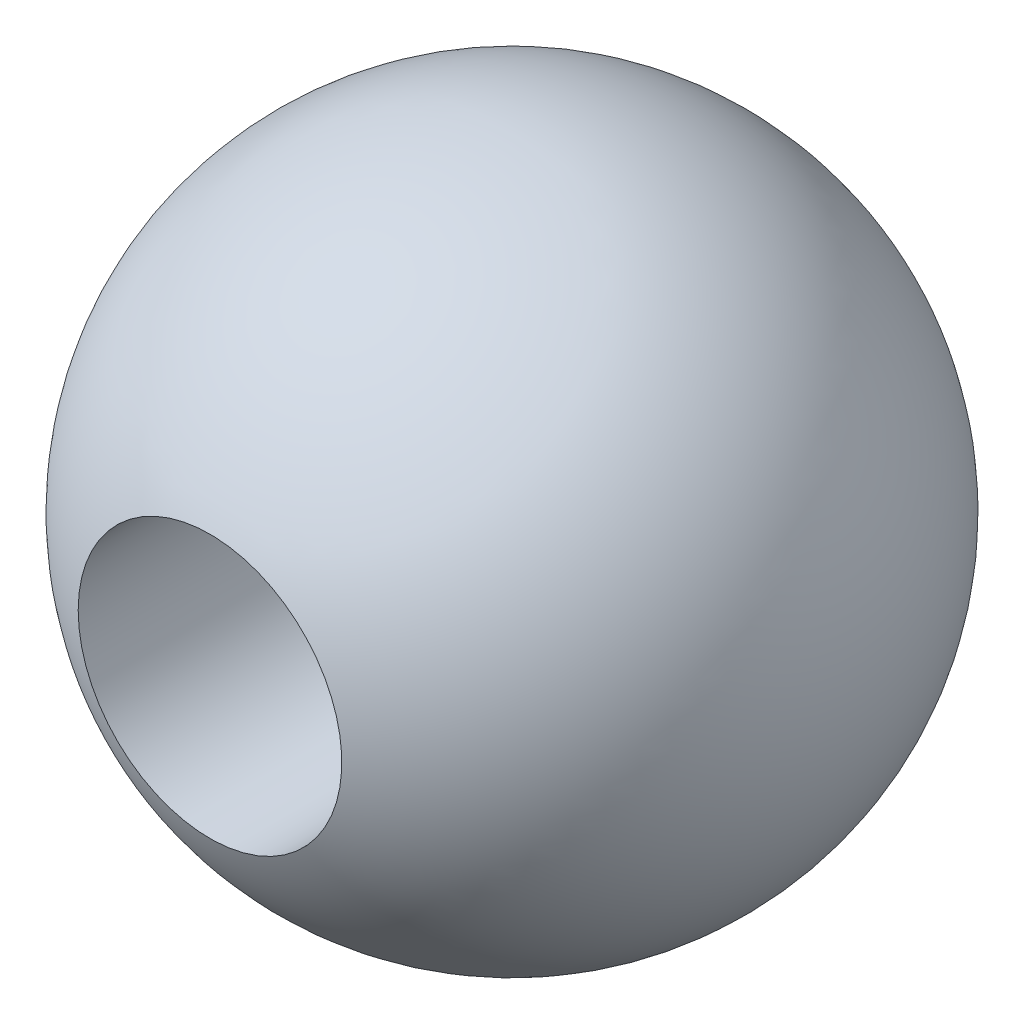
ISO-10303-21;
HEADER;
FILE_DESCRIPTION(('STEP AP214'),'2;1');
FILE_NAME('part.step','',(''),(''),'','','');
FILE_SCHEMA(('AUTOMOTIVE_DESIGN { 1 0 10303 214 1 1 1 1 }'));
ENDSEC;
DATA;
#1=APPLICATION_CONTEXT('core data for automotive mechanical design processes');
#2=APPLICATION_PROTOCOL_DEFINITION('international standard','automotive_design',2000,#1);
#3=PRODUCT_CONTEXT('',#1,'mechanical');
#4=PRODUCT('Part','Part','',(#3));
#5=PRODUCT_RELATED_PRODUCT_CATEGORY('part','',(#4));
#6=PRODUCT_DEFINITION_FORMATION('','',#4);
#7=PRODUCT_DEFINITION_CONTEXT('part definition',#1,'design');
#8=PRODUCT_DEFINITION('design','',#6,#7);
#9=PRODUCT_DEFINITION_SHAPE('','',#8);
#10=(LENGTH_UNIT() NAMED_UNIT(*) SI_UNIT(.MILLI.,.METRE.));
#11=(NAMED_UNIT(*) PLANE_ANGLE_UNIT() SI_UNIT($,.RADIAN.));
#12=(NAMED_UNIT(*) SI_UNIT($,.STERADIAN.) SOLID_ANGLE_UNIT());
#13=UNCERTAINTY_MEASURE_WITH_UNIT(LENGTH_MEASURE(1.E-05),#10,'distance_accuracy_value','');
#14=(GEOMETRIC_REPRESENTATION_CONTEXT(3) GLOBAL_UNCERTAINTY_ASSIGNED_CONTEXT((#13)) GLOBAL_UNIT_ASSIGNED_CONTEXT((#10,
#11,#12)) REPRESENTATION_CONTEXT('',''));
#15=CARTESIAN_POINT('',(0.,0.,0.));
#16=DIRECTION('',(0.,0.,1.));
#17=DIRECTION('',(1.,0.,0.));
#18=AXIS2_PLACEMENT_3D('',#15,#16,#17);
#19=CARTESIAN_POINT('',(0.,0.,0.));
#20=DIRECTION('',(0.,1.,0.));
#21=DIRECTION('',(1.,0.,0.));
#22=AXIS2_PLACEMENT_3D('',#19,#20,#21);
#23=SPHERICAL_SURFACE('',#22,6.35);
#24=CARTESIAN_POINT('',(0.,0.,0.));
#25=DIRECTION('',(0.,0.,-1.));
#26=DIRECTION('',(-1.,0.,0.));
#27=AXIS2_PLACEMENT_3D('',#24,#25,#26);
#28=SPHERICAL_SURFACE('',#27,6.35);
#29=CARTESIAN_POINT('',(0.,0.,5.81987113259392));
#30=DIRECTION('',(0.,0.,-1.));
#31=DIRECTION('',(-1.,0.,0.));
#32=AXIS2_PLACEMENT_3D('',#29,#30,#31);
#33=CIRCLE('',#32,2.54);
#34=CARTESIAN_POINT('',(-2.54,0.,5.81987113259392));
#35=VERTEX_POINT('',#34);
#36=EDGE_CURVE('E10',#35,#35,#33,.T.);
#37=ORIENTED_EDGE('',*,*,#36,.T.);
#38=EDGE_LOOP('',(#37));
#39=FACE_BOUND('',#38,.T.);
#40=CARTESIAN_POINT('',(0.,0.,-5.81987113259392));
#41=DIRECTION('',(0.,0.,1.));
#42=DIRECTION('',(1.,0.,0.));
#43=AXIS2_PLACEMENT_3D('',#40,#41,#42);
#44=CIRCLE('',#43,2.54);
#45=CARTESIAN_POINT('',(2.54,0.,-5.81987113259392));
#46=VERTEX_POINT('',#45);
#47=EDGE_CURVE('E38',#46,#46,#44,.T.);
#48=ORIENTED_EDGE('',*,*,#47,.T.);
#49=EDGE_LOOP('',(#48));
#50=FACE_BOUND('',#49,.T.);
#51=ADVANCED_FACE('F32',(#39,#50),#28,.T.);
#52=CARTESIAN_POINT('',(0.,0.,-6.35));
#53=DIRECTION('',(0.,0.,1.));
#54=DIRECTION('',(1.,0.,0.));
#55=AXIS2_PLACEMENT_3D('',#52,#53,#54);
#56=CYLINDRICAL_SURFACE('',#55,2.54);
#57=ORIENTED_EDGE('',*,*,#47,.F.);
#58=EDGE_LOOP('',(#57));
#59=FACE_BOUND('',#58,.T.);
#60=ORIENTED_EDGE('',*,*,#36,.F.);
#61=EDGE_LOOP('',(#60));
#62=FACE_BOUND('',#61,.T.);
#63=ADVANCED_FACE('F45',(#59,#62),#56,.F.);
#64=CLOSED_SHELL('',(#51,#63));
#65=MANIFOLD_SOLID_BREP('B2',#64);
#66=ADVANCED_BREP_SHAPE_REPRESENTATION('',(#18,#65),#14);
#67=SHAPE_DEFINITION_REPRESENTATION(#9,#66);
ENDSEC;
END-ISO-10303-21;
